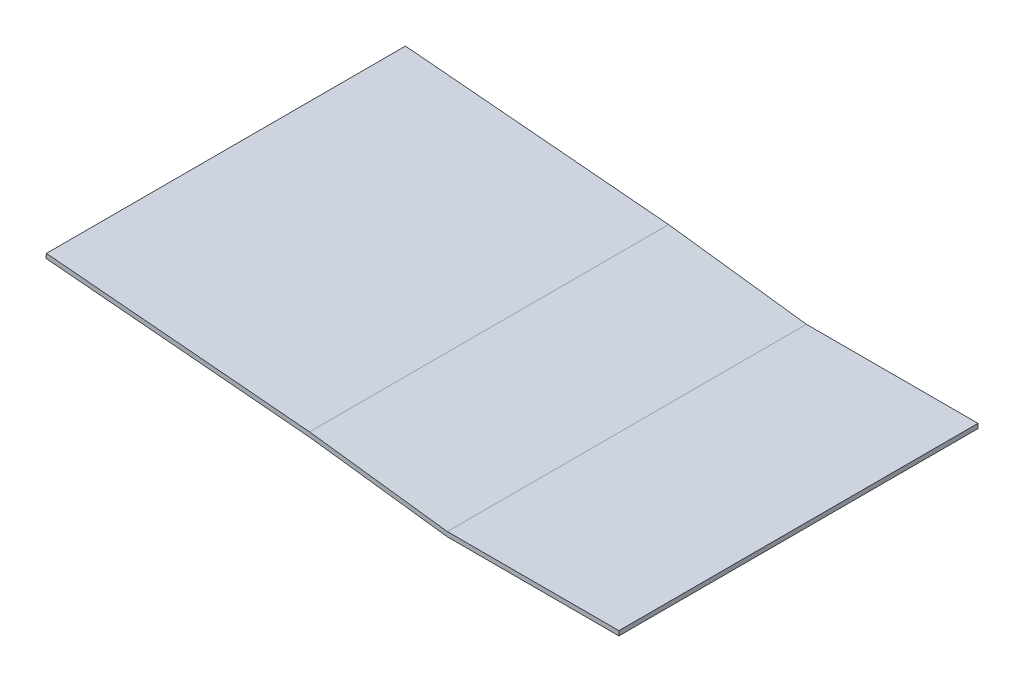
ISO-10303-21;
HEADER;
FILE_DESCRIPTION(('STEP AP214'),'2;1');
FILE_NAME('part.step','',(''),(''),'','','');
FILE_SCHEMA(('AUTOMOTIVE_DESIGN { 1 0 10303 214 1 1 1 1 }'));
ENDSEC;
DATA;
#1=APPLICATION_CONTEXT('core data for automotive mechanical design processes');
#2=APPLICATION_PROTOCOL_DEFINITION('international standard','automotive_design',2000,#1);
#3=PRODUCT_CONTEXT('',#1,'mechanical');
#4=PRODUCT('Part','Part','',(#3));
#5=PRODUCT_RELATED_PRODUCT_CATEGORY('part','',(#4));
#6=PRODUCT_DEFINITION_FORMATION('','',#4);
#7=PRODUCT_DEFINITION_CONTEXT('part definition',#1,'design');
#8=PRODUCT_DEFINITION('design','',#6,#7);
#9=PRODUCT_DEFINITION_SHAPE('','',#8);
#10=(LENGTH_UNIT() NAMED_UNIT(*) SI_UNIT(.MILLI.,.METRE.));
#11=(NAMED_UNIT(*) PLANE_ANGLE_UNIT() SI_UNIT($,.RADIAN.));
#12=(NAMED_UNIT(*) SI_UNIT($,.STERADIAN.) SOLID_ANGLE_UNIT());
#13=UNCERTAINTY_MEASURE_WITH_UNIT(LENGTH_MEASURE(1.E-05),#10,'distance_accuracy_value','');
#14=(GEOMETRIC_REPRESENTATION_CONTEXT(3) GLOBAL_UNCERTAINTY_ASSIGNED_CONTEXT((#13)) GLOBAL_UNIT_ASSIGNED_CONTEXT((#10,
#11,#12)) REPRESENTATION_CONTEXT('',''));
#15=CARTESIAN_POINT('',(0.,0.,0.));
#16=DIRECTION('',(0.,0.,1.));
#17=DIRECTION('',(1.,0.,0.));
#18=AXIS2_PLACEMENT_3D('',#15,#16,#17);
#19=CARTESIAN_POINT('',(-45.5504751542326,-520.644313428913,-250.));
#20=DIRECTION('',(-0.0871557427475912,-0.996194698091752,0.));
#21=DIRECTION('',(0.996194698091752,-0.0871557427475912,0.));
#22=AXIS2_PLACEMENT_3D('',#19,#20,#21);
#23=PLANE('',#22);
#24=DIRECTION('',(0.996194698091752,-0.0871557427475912,0.));
#25=VECTOR('',#24,1.);
#26=CARTESIAN_POINT('',(-45.5504751542326,-520.644313428913,0.));
#27=LINE('',#26,#25);
#28=CARTESIAN_POINT('',(-4531.80839506395,-128.147603783725,0.));
#29=VERTEX_POINT('',#28);
#30=CARTESIAN_POINT('',(-4348.10663190621,-144.219425529739,0.));
#31=VERTEX_POINT('',#30);
#32=EDGE_CURVE('E132',#29,#31,#27,.T.);
#33=ORIENTED_EDGE('',*,*,#32,.F.);
#34=DIRECTION('',(0.,0.,1.));
#35=VECTOR('',#34,1.);
#36=CARTESIAN_POINT('',(-4531.80839506395,-128.147603783725,-250.));
#37=LINE('',#36,#35);
#38=CARTESIAN_POINT('',(-4531.80839506395,-128.147603783725,-250.));
#39=VERTEX_POINT('',#38);
#40=EDGE_CURVE('E11',#39,#29,#37,.T.);
#41=ORIENTED_EDGE('',*,*,#40,.F.);
#42=DIRECTION('',(0.996194698091752,-0.0871557427475912,0.));
#43=VECTOR('',#42,1.);
#44=CARTESIAN_POINT('',(-45.5504751542326,-520.644313428913,-250.));
#45=LINE('',#44,#43);
#46=CARTESIAN_POINT('',(-4348.10663190621,-144.219425529739,-250.));
#47=VERTEX_POINT('',#46);
#48=EDGE_CURVE('E152',#39,#47,#45,.T.);
#49=ORIENTED_EDGE('',*,*,#48,.T.);
#50=DIRECTION('',(0.,0.,1.));
#51=VECTOR('',#50,1.);
#52=CARTESIAN_POINT('',(-4348.10663190621,-144.219425529739,-250.));
#53=LINE('',#52,#51);
#54=EDGE_CURVE('E38',#47,#31,#53,.T.);
#55=ORIENTED_EDGE('',*,*,#54,.T.);
#56=EDGE_LOOP('',(#33,#41,#49,#55));
#57=FACE_BOUND('',#56,.T.);
#58=ADVANCED_FACE('F35',(#57),#23,.T.);
#59=CARTESIAN_POINT('',(-4486.25791990971,392.496709645195,-250.));
#60=DIRECTION('',(-0.996194698091751,0.0871557427475926,0.));
#61=DIRECTION('',(-0.0871557427475926,-0.996194698091751,0.));
#62=AXIS2_PLACEMENT_3D('',#59,#60,#61);
#63=PLANE('',#62);
#64=DIRECTION('',(-0.0871557427475926,-0.996194698091751,0.));
#65=VECTOR('',#64,1.);
#66=CARTESIAN_POINT('',(-4486.25791990971,392.496709645195,0.));
#67=LINE('',#66,#65);
#68=CARTESIAN_POINT('',(-4531.53167558073,-124.984685617283,0.));
#69=VERTEX_POINT('',#68);
#70=EDGE_CURVE('E150',#69,#29,#67,.T.);
#71=ORIENTED_EDGE('',*,*,#70,.F.);
#72=DIRECTION('',(0.,0.,1.));
#73=VECTOR('',#72,1.);
#74=CARTESIAN_POINT('',(-4531.53167558073,-124.984685617283,-250.));
#75=LINE('',#74,#73);
#76=CARTESIAN_POINT('',(-4531.53167558073,-124.984685617283,-250.));
#77=VERTEX_POINT('',#76);
#78=EDGE_CURVE('E44',#77,#69,#75,.T.);
#79=ORIENTED_EDGE('',*,*,#78,.F.);
#80=DIRECTION('',(-0.0871557427475926,-0.996194698091751,0.));
#81=VECTOR('',#80,1.);
#82=CARTESIAN_POINT('',(-4486.25791990971,392.496709645195,-250.));
#83=LINE('',#82,#81);
#84=EDGE_CURVE('E122',#77,#39,#83,.T.);
#85=ORIENTED_EDGE('',*,*,#84,.T.);
#86=ORIENTED_EDGE('',*,*,#40,.T.);
#87=EDGE_LOOP('',(#71,#79,#85,#86));
#88=FACE_BOUND('',#87,.T.);
#89=ADVANCED_FACE('F164',(#88),#63,.T.);
#90=CARTESIAN_POINT('',(-45.2737556710704,-517.481395262772,-250.));
#91=DIRECTION('',(0.0871557427476584,0.996194698091746,0.));
#92=DIRECTION('',(-0.996194698091746,0.0871557427476584,0.));
#93=AXIS2_PLACEMENT_3D('',#90,#91,#92);
#94=PLANE('',#93);
#95=DIRECTION('',(-0.996194698091746,0.0871557427476584,0.));
#96=VECTOR('',#95,1.);
#97=CARTESIAN_POINT('',(-45.2737556710704,-517.481395262772,0.));
#98=LINE('',#97,#96);
#99=CARTESIAN_POINT('',(-4348.32480308728,-141.013210040499,0.));
#100=VERTEX_POINT('',#99);
#101=EDGE_CURVE('E109',#100,#69,#98,.T.);
#102=ORIENTED_EDGE('',*,*,#101,.F.);
#103=DIRECTION('',(0.,0.,1.));
#104=VECTOR('',#103,1.);
#105=CARTESIAN_POINT('',(-4348.32480308728,-141.013210040499,-250.));
#106=LINE('',#105,#104);
#107=CARTESIAN_POINT('',(-4348.32480308728,-141.013210040499,-250.));
#108=VERTEX_POINT('',#107);
#109=EDGE_CURVE('E104',#108,#100,#106,.T.);
#110=ORIENTED_EDGE('',*,*,#109,.F.);
#111=DIRECTION('',(-0.996194698091746,0.0871557427476584,0.));
#112=VECTOR('',#111,1.);
#113=CARTESIAN_POINT('',(-45.2737556710704,-517.481395262772,-250.));
#114=LINE('',#113,#112);
#115=EDGE_CURVE('E107',#108,#77,#114,.T.);
#116=ORIENTED_EDGE('',*,*,#115,.T.);
#117=ORIENTED_EDGE('',*,*,#78,.T.);
#118=EDGE_LOOP('',(#102,#110,#116,#117));
#119=FACE_BOUND('',#118,.T.);
#120=ADVANCED_FACE('F106',(#119),#94,.T.);
#121=CARTESIAN_POINT('',(-86.2120088844663,-680.765965810309,-250.));
#122=DIRECTION('',(0.12563627043374,0.992076371834094,0.));
#123=DIRECTION('',(-0.992076371834094,0.12563627043374,0.));
#124=AXIS2_PLACEMENT_3D('',#121,#122,#123);
#125=PLANE('',#124);
#126=DIRECTION('',(-0.992076371834094,0.12563627043374,0.));
#127=VECTOR('',#126,1.);
#128=CARTESIAN_POINT('',(-86.2120088844663,-680.765965810309,0.));
#129=LINE('',#128,#127);
#130=CARTESIAN_POINT('',(-4252.39099312387,-153.162240533,0.));
#131=VERTEX_POINT('',#130);
#132=EDGE_CURVE('E147',#131,#100,#129,.T.);
#133=ORIENTED_EDGE('',*,*,#132,.F.);
#134=DIRECTION('',(0.,0.,1.));
#135=VECTOR('',#134,1.);
#136=CARTESIAN_POINT('',(-4252.39099312387,-153.162240533,-250.));
#137=LINE('',#136,#135);
#138=CARTESIAN_POINT('',(-4252.39099312387,-153.162240533,-250.));
#139=VERTEX_POINT('',#138);
#140=EDGE_CURVE('E114',#139,#131,#137,.T.);
#141=ORIENTED_EDGE('',*,*,#140,.F.);
#142=DIRECTION('',(-0.992076371834094,0.12563627043374,0.));
#143=VECTOR('',#142,1.);
#144=CARTESIAN_POINT('',(-86.2120088844663,-680.765965810309,-250.));
#145=LINE('',#144,#143);
#146=EDGE_CURVE('E120',#139,#108,#145,.T.);
#147=ORIENTED_EDGE('',*,*,#146,.T.);
#148=ORIENTED_EDGE('',*,*,#109,.T.);
#149=EDGE_LOOP('',(#133,#141,#147,#148));
#150=FACE_BOUND('',#149,.T.);
#151=ADVANCED_FACE('F124',(#150),#125,.T.);
#152=CARTESIAN_POINT('',(5.3377100842747E-11,-153.162240531518,-250.));
#153=DIRECTION('',(-3.48500391855805E-13,1.,0.));
#154=DIRECTION('',(-1.,-3.48500391855805E-13,0.));
#155=AXIS2_PLACEMENT_3D('',#152,#153,#154);
#156=PLANE('',#155);
#157=DIRECTION('',(-1.,-3.48500391855805E-13,0.));
#158=VECTOR('',#157,1.);
#159=CARTESIAN_POINT('',(5.3377100842747E-11,-153.162240531518,0.));
#160=LINE('',#159,#158);
#161=CARTESIAN_POINT('',(-4132.9266699943,-153.162240532958,0.));
#162=VERTEX_POINT('',#161);
#163=EDGE_CURVE('E144',#162,#131,#160,.T.);
#164=ORIENTED_EDGE('',*,*,#163,.F.);
#165=DIRECTION('',(0.,0.,1.));
#166=VECTOR('',#165,1.);
#167=CARTESIAN_POINT('',(-4132.9266699943,-153.162240532958,-250.));
#168=LINE('',#167,#166);
#169=CARTESIAN_POINT('',(-4132.9266699943,-153.162240532958,-250.));
#170=VERTEX_POINT('',#169);
#171=EDGE_CURVE('E156',#170,#162,#168,.T.);
#172=ORIENTED_EDGE('',*,*,#171,.F.);
#173=DIRECTION('',(-1.,-3.48500391855805E-13,0.));
#174=VECTOR('',#173,1.);
#175=CARTESIAN_POINT('',(5.3377100842747E-11,-153.162240531518,-250.));
#176=LINE('',#175,#174);
#177=EDGE_CURVE('E125',#170,#139,#176,.T.);
#178=ORIENTED_EDGE('',*,*,#177,.T.);
#179=ORIENTED_EDGE('',*,*,#140,.T.);
#180=EDGE_LOOP('',(#164,#172,#178,#179));
#181=FACE_BOUND('',#180,.T.);
#182=ADVANCED_FACE('F177',(#181),#156,.T.);
#183=CARTESIAN_POINT('',(-4132.9266699943,0.,-250.));
#184=DIRECTION('',(1.,0.,0.));
#185=DIRECTION('',(0.,0.,-1.));
#186=AXIS2_PLACEMENT_3D('',#183,#184,#185);
#187=PLANE('',#186);
#188=DIRECTION('',(0.,1.,0.));
#189=VECTOR('',#188,1.);
#190=CARTESIAN_POINT('',(-4132.9266699943,0.,0.));
#191=LINE('',#190,#189);
#192=CARTESIAN_POINT('',(-4132.9266699943,-156.337240532997,0.));
#193=VERTEX_POINT('',#192);
#194=EDGE_CURVE('E141',#193,#162,#191,.T.);
#195=ORIENTED_EDGE('',*,*,#194,.F.);
#196=DIRECTION('',(0.,0.,1.));
#197=VECTOR('',#196,1.);
#198=CARTESIAN_POINT('',(-4132.9266699943,-156.337240532997,-250.));
#199=LINE('',#198,#197);
#200=CARTESIAN_POINT('',(-4132.9266699943,-156.337240532997,-250.));
#201=VERTEX_POINT('',#200);
#202=EDGE_CURVE('E158',#201,#193,#199,.T.);
#203=ORIENTED_EDGE('',*,*,#202,.F.);
#204=DIRECTION('',(0.,1.,0.));
#205=VECTOR('',#204,1.);
#206=CARTESIAN_POINT('',(-4132.9266699943,0.,-250.));
#207=LINE('',#206,#205);
#208=EDGE_CURVE('E127',#201,#170,#207,.T.);
#209=ORIENTED_EDGE('',*,*,#208,.T.);
#210=ORIENTED_EDGE('',*,*,#171,.T.);
#211=EDGE_LOOP('',(#195,#203,#209,#210));
#212=FACE_BOUND('',#211,.T.);
#213=ADVANCED_FACE('F180',(#212),#187,.T.);
#214=CARTESIAN_POINT('',(0.,-156.337240532999,-250.));
#215=DIRECTION('',(0.,-1.,0.));
#216=DIRECTION('',(1.,0.,0.));
#217=AXIS2_PLACEMENT_3D('',#214,#215,#216);
#218=PLANE('',#217);
#219=DIRECTION('',(1.,0.,0.));
#220=VECTOR('',#219,1.);
#221=CARTESIAN_POINT('',(0.,-156.337240532999,0.));
#222=LINE('',#221,#220);
#223=CARTESIAN_POINT('',(-4252.39099312387,-156.337240532997,0.));
#224=VERTEX_POINT('',#223);
#225=EDGE_CURVE('E138',#224,#193,#222,.T.);
#226=ORIENTED_EDGE('',*,*,#225,.F.);
#227=DIRECTION('',(0.,0.,1.));
#228=VECTOR('',#227,1.);
#229=CARTESIAN_POINT('',(-4252.39099312387,-156.337240532997,-250.));
#230=LINE('',#229,#228);
#231=CARTESIAN_POINT('',(-4252.39099312387,-156.337240532997,-250.));
#232=VERTEX_POINT('',#231);
#233=EDGE_CURVE('E159',#232,#224,#230,.T.);
#234=ORIENTED_EDGE('',*,*,#233,.F.);
#235=DIRECTION('',(1.,0.,0.));
#236=VECTOR('',#235,1.);
#237=CARTESIAN_POINT('',(0.,-156.337240532999,-250.));
#238=LINE('',#237,#236);
#239=EDGE_CURVE('E261',#232,#201,#238,.T.);
#240=ORIENTED_EDGE('',*,*,#239,.T.);
#241=ORIENTED_EDGE('',*,*,#202,.T.);
#242=EDGE_LOOP('',(#226,#234,#240,#241));
#243=FACE_BOUND('',#242,.T.);
#244=ADVANCED_FACE('F184',(#243),#218,.T.);
#245=CARTESIAN_POINT('',(-86.5630737613079,-683.740418367323,-250.));
#246=DIRECTION('',(-0.125599684978748,-0.992081004320332,0.));
#247=DIRECTION('',(0.992081004320332,-0.125599684978748,0.));
#248=AXIS2_PLACEMENT_3D('',#245,#246,#247);
#249=PLANE('',#248);
#250=DIRECTION('',(0.992081004320332,-0.125599684978748,0.));
#251=VECTOR('',#250,1.);
#252=CARTESIAN_POINT('',(-86.5630737613079,-683.740418367323,0.));
#253=LINE('',#252,#251);
#254=EDGE_CURVE('E135',#31,#224,#253,.T.);
#255=ORIENTED_EDGE('',*,*,#254,.F.);
#256=ORIENTED_EDGE('',*,*,#54,.F.);
#257=DIRECTION('',(0.992081004320332,-0.125599684978748,0.));
#258=VECTOR('',#257,1.);
#259=CARTESIAN_POINT('',(-86.5630737613079,-683.740418367323,-250.));
#260=LINE('',#259,#258);
#261=EDGE_CURVE('E262',#47,#232,#260,.T.);
#262=ORIENTED_EDGE('',*,*,#261,.T.);
#263=ORIENTED_EDGE('',*,*,#233,.T.);
#264=EDGE_LOOP('',(#255,#256,#262,#263));
#265=FACE_BOUND('',#264,.T.);
#266=ADVANCED_FACE('F161',(#265),#249,.T.);
#267=CARTESIAN_POINT('',(0.,0.,-250.));
#268=DIRECTION('',(0.,0.,1.));
#269=DIRECTION('',(1.,0.,0.));
#270=AXIS2_PLACEMENT_3D('',#267,#268,#269);
#271=PLANE('',#270);
#272=ORIENTED_EDGE('',*,*,#48,.F.);
#273=ORIENTED_EDGE('',*,*,#84,.F.);
#274=ORIENTED_EDGE('',*,*,#115,.F.);
#275=ORIENTED_EDGE('',*,*,#146,.F.);
#276=ORIENTED_EDGE('',*,*,#177,.F.);
#277=ORIENTED_EDGE('',*,*,#208,.F.);
#278=ORIENTED_EDGE('',*,*,#239,.F.);
#279=ORIENTED_EDGE('',*,*,#261,.F.);
#280=EDGE_LOOP('',(#272,#273,#274,#275,#276,#277,#278,#279));
#281=FACE_BOUND('',#280,.T.);
#282=ADVANCED_FACE('F118',(#281),#271,.F.);
#283=CARTESIAN_POINT('',(0.,0.,0.));
#284=DIRECTION('',(0.,0.,1.));
#285=DIRECTION('',(1.,0.,0.));
#286=AXIS2_PLACEMENT_3D('',#283,#284,#285);
#287=PLANE('',#286);
#288=ORIENTED_EDGE('',*,*,#32,.T.);
#289=ORIENTED_EDGE('',*,*,#254,.T.);
#290=ORIENTED_EDGE('',*,*,#225,.T.);
#291=ORIENTED_EDGE('',*,*,#194,.T.);
#292=ORIENTED_EDGE('',*,*,#163,.T.);
#293=ORIENTED_EDGE('',*,*,#132,.T.);
#294=ORIENTED_EDGE('',*,*,#101,.T.);
#295=ORIENTED_EDGE('',*,*,#70,.T.);
#296=EDGE_LOOP('',(#288,#289,#290,#291,#292,#293,#294,#295));
#297=FACE_BOUND('',#296,.T.);
#298=ADVANCED_FACE('F163',(#297),#287,.T.);
#299=CLOSED_SHELL('',(#58,#89,#120,#151,#182,#213,#244,#266,#282,#298));
#300=MANIFOLD_SOLID_BREP('B2',#299);
#301=ADVANCED_BREP_SHAPE_REPRESENTATION('',(#18,#300),#14);
#302=SHAPE_DEFINITION_REPRESENTATION(#9,#301);
ENDSEC;
END-ISO-10303-21;
